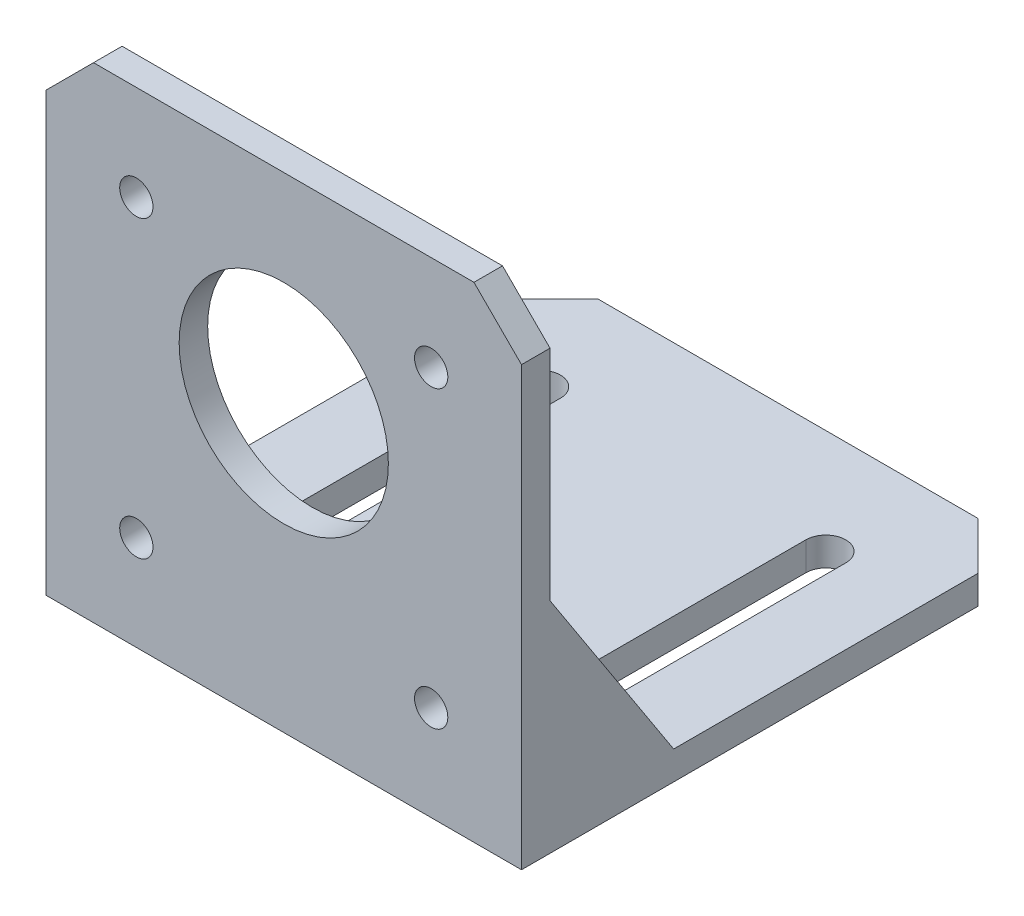
ISO-10303-21;
HEADER;
FILE_DESCRIPTION(('STEP AP214'),'2;1');
FILE_NAME('part.step','',(''),(''),'','','');
FILE_SCHEMA(('AUTOMOTIVE_DESIGN { 1 0 10303 214 1 1 1 1 }'));
ENDSEC;
DATA;
#1=APPLICATION_CONTEXT('core data for automotive mechanical design processes');
#2=APPLICATION_PROTOCOL_DEFINITION('international standard','automotive_design',2000,#1);
#3=PRODUCT_CONTEXT('',#1,'mechanical');
#4=PRODUCT('Part','Part','',(#3));
#5=PRODUCT_RELATED_PRODUCT_CATEGORY('part','',(#4));
#6=PRODUCT_DEFINITION_FORMATION('','',#4);
#7=PRODUCT_DEFINITION_CONTEXT('part definition',#1,'design');
#8=PRODUCT_DEFINITION('design','',#6,#7);
#9=PRODUCT_DEFINITION_SHAPE('','',#8);
#10=(LENGTH_UNIT() NAMED_UNIT(*) SI_UNIT(.MILLI.,.METRE.));
#11=(NAMED_UNIT(*) PLANE_ANGLE_UNIT() SI_UNIT($,.RADIAN.));
#12=(NAMED_UNIT(*) SI_UNIT($,.STERADIAN.) SOLID_ANGLE_UNIT());
#13=UNCERTAINTY_MEASURE_WITH_UNIT(LENGTH_MEASURE(1.E-05),#10,'distance_accuracy_value','');
#14=(GEOMETRIC_REPRESENTATION_CONTEXT(3) GLOBAL_UNCERTAINTY_ASSIGNED_CONTEXT((#13)) GLOBAL_UNIT_ASSIGNED_CONTEXT((#10,
#11,#12)) REPRESENTATION_CONTEXT('',''));
#15=CARTESIAN_POINT('',(0.,0.,0.));
#16=DIRECTION('',(0.,0.,1.));
#17=DIRECTION('',(1.,0.,0.));
#18=AXIS2_PLACEMENT_3D('',#15,#16,#17);
#19=CARTESIAN_POINT('',(0.,0.,0.));
#20=DIRECTION('',(0.,0.,1.));
#21=DIRECTION('',(1.,0.,0.));
#22=AXIS2_PLACEMENT_3D('',#19,#20,#21);
#23=PLANE('',#22);
#24=CARTESIAN_POINT('',(15.5,15.5,0.));
#25=DIRECTION('',(0.,0.,1.));
#26=DIRECTION('',(-1.,0.,0.));
#27=AXIS2_PLACEMENT_3D('',#24,#25,#26);
#28=CIRCLE('',#27,1.75);
#29=CARTESIAN_POINT('',(13.75,15.5,0.));
#30=VERTEX_POINT('',#29);
#31=EDGE_CURVE('E289',#30,#30,#28,.T.);
#32=ORIENTED_EDGE('',*,*,#31,.T.);
#33=EDGE_LOOP('',(#32));
#34=FACE_BOUND('',#33,.T.);
#35=CARTESIAN_POINT('',(-15.5,-15.5,0.));
#36=DIRECTION('',(0.,0.,1.));
#37=DIRECTION('',(-1.,0.,0.));
#38=AXIS2_PLACEMENT_3D('',#35,#36,#37);
#39=CIRCLE('',#38,1.75);
#40=CARTESIAN_POINT('',(-17.25,-15.5,0.));
#41=VERTEX_POINT('',#40);
#42=EDGE_CURVE('E296',#41,#41,#39,.T.);
#43=ORIENTED_EDGE('',*,*,#42,.T.);
#44=EDGE_LOOP('',(#43));
#45=FACE_BOUND('',#44,.T.);
#46=CARTESIAN_POINT('',(0.,4.50000000000001,0.));
#47=DIRECTION('',(0.,0.,1.));
#48=DIRECTION('',(1.,0.,0.));
#49=AXIS2_PLACEMENT_3D('',#46,#47,#48);
#50=CIRCLE('',#49,11.);
#51=CARTESIAN_POINT('',(11.,4.50000000000001,0.));
#52=VERTEX_POINT('',#51);
#53=EDGE_CURVE('E308',#52,#52,#50,.T.);
#54=ORIENTED_EDGE('',*,*,#53,.T.);
#55=EDGE_LOOP('',(#54));
#56=FACE_BOUND('',#55,.T.);
#57=CARTESIAN_POINT('',(-15.5,15.5,0.));
#58=DIRECTION('',(0.,0.,1.));
#59=DIRECTION('',(1.,0.,0.));
#60=AXIS2_PLACEMENT_3D('',#57,#58,#59);
#61=CIRCLE('',#60,1.75);
#62=CARTESIAN_POINT('',(-13.75,15.5,0.));
#63=VERTEX_POINT('',#62);
#64=EDGE_CURVE('E302',#63,#63,#61,.T.);
#65=ORIENTED_EDGE('',*,*,#64,.T.);
#66=EDGE_LOOP('',(#65));
#67=FACE_BOUND('',#66,.T.);
#68=CARTESIAN_POINT('',(15.5,-15.5,0.));
#69=DIRECTION('',(0.,0.,1.));
#70=DIRECTION('',(1.,0.,0.));
#71=AXIS2_PLACEMENT_3D('',#68,#69,#70);
#72=CIRCLE('',#71,1.75);
#73=CARTESIAN_POINT('',(17.25,-15.5,0.));
#74=VERTEX_POINT('',#73);
#75=EDGE_CURVE('E288',#74,#74,#72,.T.);
#76=ORIENTED_EDGE('',*,*,#75,.T.);
#77=EDGE_LOOP('',(#76));
#78=FACE_BOUND('',#77,.T.);
#79=DIRECTION('',(0.,1.,0.));
#80=VECTOR('',#79,1.);
#81=CARTESIAN_POINT('',(-22.,-22.5,0.));
#82=LINE('',#81,#80);
#83=CARTESIAN_POINT('',(-22.,-22.5,0.));
#84=VERTEX_POINT('',#83);
#85=CARTESIAN_POINT('',(-22.,-2.50000000000002,0.));
#86=VERTEX_POINT('',#85);
#87=EDGE_CURVE('E52',#84,#86,#82,.T.);
#88=ORIENTED_EDGE('',*,*,#87,.T.);
#89=DIRECTION('',(-1.,0.,0.));
#90=VECTOR('',#89,1.);
#91=CARTESIAN_POINT('',(-22.,-2.50000000000002,0.));
#92=LINE('',#91,#90);
#93=CARTESIAN_POINT('',(-25.,-2.50000000000002,0.));
#94=VERTEX_POINT('',#93);
#95=EDGE_CURVE('E56',#86,#94,#92,.T.);
#96=ORIENTED_EDGE('',*,*,#95,.T.);
#97=DIRECTION('',(0.,-1.,0.));
#98=VECTOR('',#97,1.);
#99=CARTESIAN_POINT('',(-25.,25.5,0.));
#100=LINE('',#99,#98);
#101=CARTESIAN_POINT('',(-25.,20.5,0.));
#102=VERTEX_POINT('',#101);
#103=EDGE_CURVE('E321',#102,#94,#100,.T.);
#104=ORIENTED_EDGE('',*,*,#103,.F.);
#105=DIRECTION('',(-0.707106781186549,-0.707106781186546,0.));
#106=VECTOR('',#105,1.);
#107=CARTESIAN_POINT('',(-25.,20.5,0.));
#108=LINE('',#107,#106);
#109=CARTESIAN_POINT('',(-20.,25.5,0.));
#110=VERTEX_POINT('',#109);
#111=EDGE_CURVE('E733',#102,#110,#108,.F.);
#112=ORIENTED_EDGE('',*,*,#111,.T.);
#113=DIRECTION('',(-1.,0.,0.));
#114=VECTOR('',#113,1.);
#115=CARTESIAN_POINT('',(-25.,25.5,0.));
#116=LINE('',#115,#114);
#117=CARTESIAN_POINT('',(20.,25.5,0.));
#118=VERTEX_POINT('',#117);
#119=EDGE_CURVE('E331',#118,#110,#116,.T.);
#120=ORIENTED_EDGE('',*,*,#119,.F.);
#121=DIRECTION('',(-0.707106781186546,0.707106781186549,0.));
#122=VECTOR('',#121,1.);
#123=CARTESIAN_POINT('',(20.,25.5,0.));
#124=LINE('',#123,#122);
#125=CARTESIAN_POINT('',(25.,20.5,0.));
#126=VERTEX_POINT('',#125);
#127=EDGE_CURVE('E730',#118,#126,#124,.F.);
#128=ORIENTED_EDGE('',*,*,#127,.T.);
#129=DIRECTION('',(0.,1.,0.));
#130=VECTOR('',#129,1.);
#131=CARTESIAN_POINT('',(25.,25.5,0.));
#132=LINE('',#131,#130);
#133=CARTESIAN_POINT('',(25.,-2.50000000000002,0.));
#134=VERTEX_POINT('',#133);
#135=EDGE_CURVE('E314',#134,#126,#132,.T.);
#136=ORIENTED_EDGE('',*,*,#135,.F.);
#137=DIRECTION('',(1.,0.,0.));
#138=VECTOR('',#137,1.);
#139=CARTESIAN_POINT('',(22.,-2.50000000000002,0.));
#140=LINE('',#139,#138);
#141=CARTESIAN_POINT('',(22.,-2.50000000000002,0.));
#142=VERTEX_POINT('',#141);
#143=EDGE_CURVE('E202',#142,#134,#140,.T.);
#144=ORIENTED_EDGE('',*,*,#143,.F.);
#145=DIRECTION('',(0.,-1.,0.));
#146=VECTOR('',#145,1.);
#147=CARTESIAN_POINT('',(22.,-22.5,0.));
#148=LINE('',#147,#146);
#149=CARTESIAN_POINT('',(22.,-22.5,0.));
#150=VERTEX_POINT('',#149);
#151=EDGE_CURVE('E196',#142,#150,#148,.T.);
#152=ORIENTED_EDGE('',*,*,#151,.T.);
#153=DIRECTION('',(1.,0.,0.));
#154=VECTOR('',#153,1.);
#155=CARTESIAN_POINT('',(-25.,-22.5,0.));
#156=LINE('',#155,#154);
#157=EDGE_CURVE('E38',#84,#150,#156,.T.);
#158=ORIENTED_EDGE('',*,*,#157,.F.);
#159=EDGE_LOOP('',(#88,#96,#104,#112,#120,#128,#136,#144,#152,#158));
#160=FACE_BOUND('',#159,.T.);
#161=ADVANCED_FACE('F34',(#34,#45,#56,#67,#78,#160),#23,.F.);
#162=CARTESIAN_POINT('',(0.,0.,3.));
#163=DIRECTION('',(0.,0.,1.));
#164=DIRECTION('',(1.,0.,0.));
#165=AXIS2_PLACEMENT_3D('',#162,#163,#164);
#166=PLANE('',#165);
#167=CARTESIAN_POINT('',(15.5,-15.5,3.));
#168=DIRECTION('',(0.,0.,1.));
#169=DIRECTION('',(1.,0.,0.));
#170=AXIS2_PLACEMENT_3D('',#167,#168,#169);
#171=CIRCLE('',#170,1.75);
#172=CARTESIAN_POINT('',(17.25,-15.5,3.));
#173=VERTEX_POINT('',#172);
#174=EDGE_CURVE('E293',#173,#173,#171,.T.);
#175=ORIENTED_EDGE('',*,*,#174,.F.);
#176=EDGE_LOOP('',(#175));
#177=FACE_BOUND('',#176,.T.);
#178=CARTESIAN_POINT('',(-15.5,15.5,3.));
#179=DIRECTION('',(0.,0.,1.));
#180=DIRECTION('',(1.,0.,0.));
#181=AXIS2_PLACEMENT_3D('',#178,#179,#180);
#182=CIRCLE('',#181,1.75);
#183=CARTESIAN_POINT('',(-13.75,15.5,3.));
#184=VERTEX_POINT('',#183);
#185=EDGE_CURVE('E305',#184,#184,#182,.T.);
#186=ORIENTED_EDGE('',*,*,#185,.F.);
#187=EDGE_LOOP('',(#186));
#188=FACE_BOUND('',#187,.T.);
#189=DIRECTION('',(-1.,0.,0.));
#190=VECTOR('',#189,1.);
#191=CARTESIAN_POINT('',(-25.,25.5,3.));
#192=LINE('',#191,#190);
#193=CARTESIAN_POINT('',(20.,25.5,3.));
#194=VERTEX_POINT('',#193);
#195=CARTESIAN_POINT('',(-20.,25.5,3.));
#196=VERTEX_POINT('',#195);
#197=EDGE_CURVE('E320',#194,#196,#192,.T.);
#198=ORIENTED_EDGE('',*,*,#197,.T.);
#199=DIRECTION('',(0.707106781186549,0.707106781186546,0.));
#200=VECTOR('',#199,1.);
#201=CARTESIAN_POINT('',(-22.7499999999999,22.75,3.));
#202=LINE('',#201,#200);
#203=CARTESIAN_POINT('',(-25.,20.5,3.));
#204=VERTEX_POINT('',#203);
#205=EDGE_CURVE('E742',#196,#204,#202,.F.);
#206=ORIENTED_EDGE('',*,*,#205,.T.);
#207=DIRECTION('',(0.,-1.,0.));
#208=VECTOR('',#207,1.);
#209=CARTESIAN_POINT('',(-25.,25.5,3.));
#210=LINE('',#209,#208);
#211=CARTESIAN_POINT('',(-25.,-25.5,3.));
#212=VERTEX_POINT('',#211);
#213=EDGE_CURVE('E324',#204,#212,#210,.T.);
#214=ORIENTED_EDGE('',*,*,#213,.T.);
#215=DIRECTION('',(1.,0.,0.));
#216=VECTOR('',#215,1.);
#217=CARTESIAN_POINT('',(-25.,-25.5,3.));
#218=LINE('',#217,#216);
#219=CARTESIAN_POINT('',(25.,-25.5,3.));
#220=VERTEX_POINT('',#219);
#221=EDGE_CURVE('E326',#212,#220,#218,.T.);
#222=ORIENTED_EDGE('',*,*,#221,.T.);
#223=DIRECTION('',(0.,1.,0.));
#224=VECTOR('',#223,1.);
#225=CARTESIAN_POINT('',(25.,25.5,3.));
#226=LINE('',#225,#224);
#227=CARTESIAN_POINT('',(25.,20.5,3.));
#228=VERTEX_POINT('',#227);
#229=EDGE_CURVE('E317',#220,#228,#226,.T.);
#230=ORIENTED_EDGE('',*,*,#229,.T.);
#231=DIRECTION('',(0.707106781186546,-0.707106781186549,0.));
#232=VECTOR('',#231,1.);
#233=CARTESIAN_POINT('',(22.75,22.7499999999999,3.));
#234=LINE('',#233,#232);
#235=EDGE_CURVE('E740',#228,#194,#234,.F.);
#236=ORIENTED_EDGE('',*,*,#235,.T.);
#237=EDGE_LOOP('',(#198,#206,#214,#222,#230,#236));
#238=FACE_BOUND('',#237,.T.);
#239=CARTESIAN_POINT('',(0.,4.50000000000001,3.));
#240=DIRECTION('',(0.,0.,1.));
#241=DIRECTION('',(1.,0.,0.));
#242=AXIS2_PLACEMENT_3D('',#239,#240,#241);
#243=CIRCLE('',#242,11.);
#244=CARTESIAN_POINT('',(11.,4.50000000000001,3.));
#245=VERTEX_POINT('',#244);
#246=EDGE_CURVE('E311',#245,#245,#243,.T.);
#247=ORIENTED_EDGE('',*,*,#246,.F.);
#248=EDGE_LOOP('',(#247));
#249=FACE_BOUND('',#248,.T.);
#250=CARTESIAN_POINT('',(-15.5,-15.5,3.));
#251=DIRECTION('',(0.,0.,1.));
#252=DIRECTION('',(-1.,0.,0.));
#253=AXIS2_PLACEMENT_3D('',#250,#251,#252);
#254=CIRCLE('',#253,1.75);
#255=CARTESIAN_POINT('',(-17.25,-15.5,3.));
#256=VERTEX_POINT('',#255);
#257=EDGE_CURVE('E299',#256,#256,#254,.T.);
#258=ORIENTED_EDGE('',*,*,#257,.F.);
#259=EDGE_LOOP('',(#258));
#260=FACE_BOUND('',#259,.T.);
#261=CARTESIAN_POINT('',(15.5,15.5,3.));
#262=DIRECTION('',(0.,0.,1.));
#263=DIRECTION('',(-1.,0.,0.));
#264=AXIS2_PLACEMENT_3D('',#261,#262,#263);
#265=CIRCLE('',#264,1.75);
#266=CARTESIAN_POINT('',(13.75,15.5,3.));
#267=VERTEX_POINT('',#266);
#268=EDGE_CURVE('E285',#267,#267,#265,.T.);
#269=ORIENTED_EDGE('',*,*,#268,.F.);
#270=EDGE_LOOP('',(#269));
#271=FACE_BOUND('',#270,.T.);
#272=ADVANCED_FACE('F405',(#177,#188,#238,#249,#260,#271),#166,.T.);
#273=CARTESIAN_POINT('',(25.,25.5,3.));
#274=DIRECTION('',(-1.,0.,0.));
#275=DIRECTION('',(0.,-1.,0.));
#276=AXIS2_PLACEMENT_3D('',#273,#274,#275);
#277=PLANE('',#276);
#278=DIRECTION('',(0.,0.838443616300637,0.544988350595414));
#279=VECTOR('',#278,1.);
#280=CARTESIAN_POINT('',(25.,-2.50000000000002,0.));
#281=LINE('',#280,#279);
#282=CARTESIAN_POINT('',(25.,-22.5,-13.));
#283=VERTEX_POINT('',#282);
#284=EDGE_CURVE('E203',#283,#134,#281,.T.);
#285=ORIENTED_EDGE('',*,*,#284,.T.);
#286=ORIENTED_EDGE('',*,*,#135,.T.);
#287=DIRECTION('',(0.,0.,1.));
#288=VECTOR('',#287,1.);
#289=CARTESIAN_POINT('',(25.,20.5,3.));
#290=LINE('',#289,#288);
#291=EDGE_CURVE('E354',#126,#228,#290,.T.);
#292=ORIENTED_EDGE('',*,*,#291,.T.);
#293=ORIENTED_EDGE('',*,*,#229,.F.);
#294=DIRECTION('',(0.,0.,-1.));
#295=VECTOR('',#294,1.);
#296=CARTESIAN_POINT('',(25.,-25.5,3.));
#297=LINE('',#296,#295);
#298=CARTESIAN_POINT('',(25.,-25.5,-45.));
#299=VERTEX_POINT('',#298);
#300=EDGE_CURVE('E328',#220,#299,#297,.T.);
#301=ORIENTED_EDGE('',*,*,#300,.T.);
#302=DIRECTION('',(0.,1.,0.));
#303=VECTOR('',#302,1.);
#304=CARTESIAN_POINT('',(25.,-22.5,-45.));
#305=LINE('',#304,#303);
#306=CARTESIAN_POINT('',(25.,-22.5,-45.));
#307=VERTEX_POINT('',#306);
#308=EDGE_CURVE('E11',#299,#307,#305,.T.);
#309=ORIENTED_EDGE('',*,*,#308,.T.);
#310=DIRECTION('',(0.,0.,1.));
#311=VECTOR('',#310,1.);
#312=CARTESIAN_POINT('',(25.,-22.5,-50.));
#313=LINE('',#312,#311);
#314=EDGE_CURVE('E282',#307,#283,#313,.T.);
#315=ORIENTED_EDGE('',*,*,#314,.T.);
#316=EDGE_LOOP('',(#285,#286,#292,#293,#301,#309,#315));
#317=FACE_BOUND('',#316,.T.);
#318=ADVANCED_FACE('F411',(#317),#277,.F.);
#319=CARTESIAN_POINT('',(-25.,25.5,3.));
#320=DIRECTION('',(0.,-1.,0.));
#321=DIRECTION('',(0.,0.,-1.));
#322=AXIS2_PLACEMENT_3D('',#319,#320,#321);
#323=PLANE('',#322);
#324=ORIENTED_EDGE('',*,*,#119,.T.);
#325=DIRECTION('',(0.,0.,1.));
#326=VECTOR('',#325,1.);
#327=CARTESIAN_POINT('',(-20.,25.5,3.));
#328=LINE('',#327,#326);
#329=EDGE_CURVE('E738',#110,#196,#328,.T.);
#330=ORIENTED_EDGE('',*,*,#329,.T.);
#331=ORIENTED_EDGE('',*,*,#197,.F.);
#332=DIRECTION('',(0.,0.,-1.));
#333=VECTOR('',#332,1.);
#334=CARTESIAN_POINT('',(20.,25.5,3.));
#335=LINE('',#334,#333);
#336=EDGE_CURVE('E735',#194,#118,#335,.T.);
#337=ORIENTED_EDGE('',*,*,#336,.T.);
#338=EDGE_LOOP('',(#324,#330,#331,#337));
#339=FACE_BOUND('',#338,.T.);
#340=ADVANCED_FACE('F423',(#339),#323,.F.);
#341=CARTESIAN_POINT('',(-25.,25.5,3.));
#342=DIRECTION('',(1.,0.,0.));
#343=DIRECTION('',(0.,1.,0.));
#344=AXIS2_PLACEMENT_3D('',#341,#342,#343);
#345=PLANE('',#344);
#346=ORIENTED_EDGE('',*,*,#103,.T.);
#347=DIRECTION('',(0.,-0.838443616300637,-0.544988350595414));
#348=VECTOR('',#347,1.);
#349=CARTESIAN_POINT('',(-25.,-2.50000000000002,0.));
#350=LINE('',#349,#348);
#351=CARTESIAN_POINT('',(-25.,-22.5,-13.));
#352=VERTEX_POINT('',#351);
#353=EDGE_CURVE('E385',#94,#352,#350,.T.);
#354=ORIENTED_EDGE('',*,*,#353,.T.);
#355=DIRECTION('',(0.,0.,1.));
#356=VECTOR('',#355,1.);
#357=CARTESIAN_POINT('',(-25.,-22.5,-50.));
#358=LINE('',#357,#356);
#359=CARTESIAN_POINT('',(-25.,-22.5,-45.));
#360=VERTEX_POINT('',#359);
#361=EDGE_CURVE('E292',#360,#352,#358,.T.);
#362=ORIENTED_EDGE('',*,*,#361,.F.);
#363=DIRECTION('',(0.,-1.,0.));
#364=VECTOR('',#363,1.);
#365=CARTESIAN_POINT('',(-25.,-25.5,-45.));
#366=LINE('',#365,#364);
#367=CARTESIAN_POINT('',(-25.,-25.5,-45.));
#368=VERTEX_POINT('',#367);
#369=EDGE_CURVE('E337',#360,#368,#366,.T.);
#370=ORIENTED_EDGE('',*,*,#369,.T.);
#371=DIRECTION('',(0.,0.,-1.));
#372=VECTOR('',#371,1.);
#373=CARTESIAN_POINT('',(-25.,-25.5,3.));
#374=LINE('',#373,#372);
#375=EDGE_CURVE('E377',#212,#368,#374,.T.);
#376=ORIENTED_EDGE('',*,*,#375,.F.);
#377=ORIENTED_EDGE('',*,*,#213,.F.);
#378=DIRECTION('',(0.,0.,-1.));
#379=VECTOR('',#378,1.);
#380=CARTESIAN_POINT('',(-25.,20.5,3.));
#381=LINE('',#380,#379);
#382=EDGE_CURVE('E724',#204,#102,#381,.T.);
#383=ORIENTED_EDGE('',*,*,#382,.T.);
#384=EDGE_LOOP('',(#346,#354,#362,#370,#376,#377,#383));
#385=FACE_BOUND('',#384,.T.);
#386=ADVANCED_FACE('F381',(#385),#345,.F.);
#387=CARTESIAN_POINT('',(-25.,-25.5,3.));
#388=DIRECTION('',(0.,1.,0.));
#389=DIRECTION('',(0.,0.,1.));
#390=AXIS2_PLACEMENT_3D('',#387,#388,#389);
#391=PLANE('',#390);
#392=DIRECTION('',(0.,0.,-1.));
#393=VECTOR('',#392,1.);
#394=CARTESIAN_POINT('',(17.1,-25.5,3.00000000000002));
#395=LINE('',#394,#393);
#396=CARTESIAN_POINT('',(17.1,-25.5,-9.00000000000001));
#397=VERTEX_POINT('',#396);
#398=CARTESIAN_POINT('',(17.1,-25.5,-39.));
#399=VERTEX_POINT('',#398);
#400=EDGE_CURVE('E241',#397,#399,#395,.T.);
#401=ORIENTED_EDGE('',*,*,#400,.T.);
#402=CARTESIAN_POINT('',(15.,-25.5,-39.));
#403=DIRECTION('',(0.,1.,0.));
#404=DIRECTION('',(0.,0.,1.));
#405=AXIS2_PLACEMENT_3D('',#402,#403,#404);
#406=CIRCLE('',#405,2.1);
#407=CARTESIAN_POINT('',(12.9,-25.5,-39.));
#408=VERTEX_POINT('',#407);
#409=EDGE_CURVE('E244',#399,#408,#406,.T.);
#410=ORIENTED_EDGE('',*,*,#409,.T.);
#411=DIRECTION('',(0.,0.,1.));
#412=VECTOR('',#411,1.);
#413=CARTESIAN_POINT('',(12.9,-25.5,3.00000000000001));
#414=LINE('',#413,#412);
#415=CARTESIAN_POINT('',(12.9,-25.5,-9.00000000000001));
#416=VERTEX_POINT('',#415);
#417=EDGE_CURVE('E229',#408,#416,#414,.T.);
#418=ORIENTED_EDGE('',*,*,#417,.T.);
#419=CARTESIAN_POINT('',(15.,-25.5,-9.00000000000001));
#420=DIRECTION('',(0.,1.,0.));
#421=DIRECTION('',(0.,0.,1.));
#422=AXIS2_PLACEMENT_3D('',#419,#420,#421);
#423=CIRCLE('',#422,2.1);
#424=EDGE_CURVE('E238',#416,#397,#423,.T.);
#425=ORIENTED_EDGE('',*,*,#424,.T.);
#426=EDGE_LOOP('',(#401,#410,#418,#425));
#427=FACE_BOUND('',#426,.T.);
#428=DIRECTION('',(0.,0.,-1.));
#429=VECTOR('',#428,1.);
#430=CARTESIAN_POINT('',(-12.9,-25.5,3.));
#431=LINE('',#430,#429);
#432=CARTESIAN_POINT('',(-12.9,-25.5,-9.00000000000001));
#433=VERTEX_POINT('',#432);
#434=CARTESIAN_POINT('',(-12.9,-25.5,-39.));
#435=VERTEX_POINT('',#434);
#436=EDGE_CURVE('E273',#433,#435,#431,.T.);
#437=ORIENTED_EDGE('',*,*,#436,.T.);
#438=CARTESIAN_POINT('',(-15.,-25.5,-39.));
#439=DIRECTION('',(0.,1.,0.));
#440=DIRECTION('',(0.,0.,1.));
#441=AXIS2_PLACEMENT_3D('',#438,#439,#440);
#442=CIRCLE('',#441,2.1);
#443=CARTESIAN_POINT('',(-17.1,-25.5,-39.));
#444=VERTEX_POINT('',#443);
#445=EDGE_CURVE('E192',#435,#444,#442,.T.);
#446=ORIENTED_EDGE('',*,*,#445,.T.);
#447=DIRECTION('',(0.,0.,1.));
#448=VECTOR('',#447,1.);
#449=CARTESIAN_POINT('',(-17.1,-25.5,3.));
#450=LINE('',#449,#448);
#451=CARTESIAN_POINT('',(-17.1,-25.5,-9.00000000000001));
#452=VERTEX_POINT('',#451);
#453=EDGE_CURVE('E261',#444,#452,#450,.T.);
#454=ORIENTED_EDGE('',*,*,#453,.T.);
#455=CARTESIAN_POINT('',(-15.,-25.5,-9.00000000000001));
#456=DIRECTION('',(0.,1.,0.));
#457=DIRECTION('',(0.,0.,1.));
#458=AXIS2_PLACEMENT_3D('',#455,#456,#457);
#459=CIRCLE('',#458,2.1);
#460=EDGE_CURVE('E270',#452,#433,#459,.T.);
#461=ORIENTED_EDGE('',*,*,#460,.T.);
#462=EDGE_LOOP('',(#437,#446,#454,#461));
#463=FACE_BOUND('',#462,.T.);
#464=ORIENTED_EDGE('',*,*,#375,.T.);
#465=DIRECTION('',(0.707106781186547,0.,-0.707106781186549));
#466=VECTOR('',#465,1.);
#467=CARTESIAN_POINT('',(-20.,-25.5,-50.));
#468=LINE('',#467,#466);
#469=CARTESIAN_POINT('',(-20.,-25.5,-50.));
#470=VERTEX_POINT('',#469);
#471=EDGE_CURVE('E44',#368,#470,#468,.T.);
#472=ORIENTED_EDGE('',*,*,#471,.T.);
#473=DIRECTION('',(-1.,0.,0.));
#474=VECTOR('',#473,1.);
#475=CARTESIAN_POINT('',(25.,-25.5,-50.));
#476=LINE('',#475,#474);
#477=CARTESIAN_POINT('',(20.,-25.5,-50.));
#478=VERTEX_POINT('',#477);
#479=EDGE_CURVE('E191',#478,#470,#476,.T.);
#480=ORIENTED_EDGE('',*,*,#479,.F.);
#481=DIRECTION('',(0.707106781186546,0.,0.70710678118655));
#482=VECTOR('',#481,1.);
#483=CARTESIAN_POINT('',(20.,-25.5,-50.));
#484=LINE('',#483,#482);
#485=EDGE_CURVE('E335',#478,#299,#484,.T.);
#486=ORIENTED_EDGE('',*,*,#485,.T.);
#487=ORIENTED_EDGE('',*,*,#300,.F.);
#488=ORIENTED_EDGE('',*,*,#221,.F.);
#489=EDGE_LOOP('',(#464,#472,#480,#486,#487,#488));
#490=FACE_BOUND('',#489,.T.);
#491=ADVANCED_FACE('F372',(#427,#463,#490),#391,.F.);
#492=CARTESIAN_POINT('',(0.,4.50000000000001,3.));
#493=DIRECTION('',(0.,0.,-1.));
#494=DIRECTION('',(-1.,0.,0.));
#495=AXIS2_PLACEMENT_3D('',#492,#493,#494);
#496=CYLINDRICAL_SURFACE('',#495,11.);
#497=ORIENTED_EDGE('',*,*,#246,.T.);
#498=EDGE_LOOP('',(#497));
#499=FACE_BOUND('',#498,.T.);
#500=ORIENTED_EDGE('',*,*,#53,.F.);
#501=EDGE_LOOP('',(#500));
#502=FACE_BOUND('',#501,.T.);
#503=ADVANCED_FACE('F419',(#499,#502),#496,.F.);
#504=CARTESIAN_POINT('',(-15.5,15.5,3.));
#505=DIRECTION('',(0.,0.,-1.));
#506=DIRECTION('',(-1.,0.,0.));
#507=AXIS2_PLACEMENT_3D('',#504,#505,#506);
#508=CYLINDRICAL_SURFACE('',#507,1.75);
#509=ORIENTED_EDGE('',*,*,#185,.T.);
#510=EDGE_LOOP('',(#509));
#511=FACE_BOUND('',#510,.T.);
#512=ORIENTED_EDGE('',*,*,#64,.F.);
#513=EDGE_LOOP('',(#512));
#514=FACE_BOUND('',#513,.T.);
#515=ADVANCED_FACE('F463',(#511,#514),#508,.F.);
#516=CARTESIAN_POINT('',(-15.5,-15.5,3.));
#517=DIRECTION('',(0.,0.,-1.));
#518=DIRECTION('',(-1.,0.,0.));
#519=AXIS2_PLACEMENT_3D('',#516,#517,#518);
#520=CYLINDRICAL_SURFACE('',#519,1.75);
#521=ORIENTED_EDGE('',*,*,#257,.T.);
#522=EDGE_LOOP('',(#521));
#523=FACE_BOUND('',#522,.T.);
#524=ORIENTED_EDGE('',*,*,#42,.F.);
#525=EDGE_LOOP('',(#524));
#526=FACE_BOUND('',#525,.T.);
#527=ADVANCED_FACE('F459',(#523,#526),#520,.F.);
#528=CARTESIAN_POINT('',(15.5,-15.5,3.));
#529=DIRECTION('',(0.,0.,-1.));
#530=DIRECTION('',(-1.,0.,0.));
#531=AXIS2_PLACEMENT_3D('',#528,#529,#530);
#532=CYLINDRICAL_SURFACE('',#531,1.75);
#533=ORIENTED_EDGE('',*,*,#174,.T.);
#534=EDGE_LOOP('',(#533));
#535=FACE_BOUND('',#534,.T.);
#536=ORIENTED_EDGE('',*,*,#75,.F.);
#537=EDGE_LOOP('',(#536));
#538=FACE_BOUND('',#537,.T.);
#539=ADVANCED_FACE('F455',(#535,#538),#532,.F.);
#540=CARTESIAN_POINT('',(15.5,15.5,3.));
#541=DIRECTION('',(0.,0.,-1.));
#542=DIRECTION('',(-1.,0.,0.));
#543=AXIS2_PLACEMENT_3D('',#540,#541,#542);
#544=CYLINDRICAL_SURFACE('',#543,1.75);
#545=ORIENTED_EDGE('',*,*,#268,.T.);
#546=EDGE_LOOP('',(#545));
#547=FACE_BOUND('',#546,.T.);
#548=ORIENTED_EDGE('',*,*,#31,.F.);
#549=EDGE_LOOP('',(#548));
#550=FACE_BOUND('',#549,.T.);
#551=ADVANCED_FACE('F434',(#547,#550),#544,.F.);
#552=CARTESIAN_POINT('',(-25.,20.5,3.));
#553=DIRECTION('',(0.707106781186546,-0.707106781186549,0.));
#554=DIRECTION('',(0.,0.,-1.));
#555=AXIS2_PLACEMENT_3D('',#552,#553,#554);
#556=PLANE('',#555);
#557=ORIENTED_EDGE('',*,*,#205,.F.);
#558=ORIENTED_EDGE('',*,*,#329,.F.);
#559=ORIENTED_EDGE('',*,*,#111,.F.);
#560=ORIENTED_EDGE('',*,*,#382,.F.);
#561=EDGE_LOOP('',(#557,#558,#559,#560));
#562=FACE_BOUND('',#561,.T.);
#563=ADVANCED_FACE('F430',(#562),#556,.F.);
#564=CARTESIAN_POINT('',(20.,25.5,3.));
#565=DIRECTION('',(-0.707106781186549,-0.707106781186546,0.));
#566=DIRECTION('',(0.,0.,-1.));
#567=AXIS2_PLACEMENT_3D('',#564,#565,#566);
#568=PLANE('',#567);
#569=ORIENTED_EDGE('',*,*,#235,.F.);
#570=ORIENTED_EDGE('',*,*,#291,.F.);
#571=ORIENTED_EDGE('',*,*,#127,.F.);
#572=ORIENTED_EDGE('',*,*,#336,.F.);
#573=EDGE_LOOP('',(#569,#570,#571,#572));
#574=FACE_BOUND('',#573,.T.);
#575=ADVANCED_FACE('F433',(#574),#568,.F.);
#576=CARTESIAN_POINT('',(-25.,-22.5,-50.));
#577=DIRECTION('',(0.,-1.,0.));
#578=DIRECTION('',(1.,0.,0.));
#579=AXIS2_PLACEMENT_3D('',#576,#577,#578);
#580=PLANE('',#579);
#581=DIRECTION('',(0.,0.,1.));
#582=VECTOR('',#581,1.);
#583=CARTESIAN_POINT('',(12.9,-22.5,-39.));
#584=LINE('',#583,#582);
#585=CARTESIAN_POINT('',(12.9,-22.5,-39.));
#586=VERTEX_POINT('',#585);
#587=CARTESIAN_POINT('',(12.9,-22.5,-9.00000000000001));
#588=VERTEX_POINT('',#587);
#589=EDGE_CURVE('E217',#586,#588,#584,.T.);
#590=ORIENTED_EDGE('',*,*,#589,.F.);
#591=CARTESIAN_POINT('',(15.,-22.5,-39.));
#592=DIRECTION('',(0.,1.,0.));
#593=DIRECTION('',(-1.,0.,0.));
#594=AXIS2_PLACEMENT_3D('',#591,#592,#593);
#595=CIRCLE('',#594,2.1);
#596=CARTESIAN_POINT('',(17.1,-22.5,-39.));
#597=VERTEX_POINT('',#596);
#598=EDGE_CURVE('E214',#597,#586,#595,.T.);
#599=ORIENTED_EDGE('',*,*,#598,.F.);
#600=DIRECTION('',(0.,0.,-1.));
#601=VECTOR('',#600,1.);
#602=CARTESIAN_POINT('',(17.1,-22.5,-39.));
#603=LINE('',#602,#601);
#604=CARTESIAN_POINT('',(17.1,-22.5,-9.00000000000001));
#605=VERTEX_POINT('',#604);
#606=EDGE_CURVE('E223',#605,#597,#603,.T.);
#607=ORIENTED_EDGE('',*,*,#606,.F.);
#608=CARTESIAN_POINT('',(15.,-22.5,-9.00000000000001));
#609=DIRECTION('',(0.,1.,0.));
#610=DIRECTION('',(1.,0.,0.));
#611=AXIS2_PLACEMENT_3D('',#608,#609,#610);
#612=CIRCLE('',#611,2.1);
#613=EDGE_CURVE('E220',#588,#605,#612,.T.);
#614=ORIENTED_EDGE('',*,*,#613,.F.);
#615=EDGE_LOOP('',(#590,#599,#607,#614));
#616=FACE_BOUND('',#615,.T.);
#617=DIRECTION('',(0.,0.,1.));
#618=VECTOR('',#617,1.);
#619=CARTESIAN_POINT('',(-17.1,-22.5,-39.));
#620=LINE('',#619,#618);
#621=CARTESIAN_POINT('',(-17.1,-22.5,-39.));
#622=VERTEX_POINT('',#621);
#623=CARTESIAN_POINT('',(-17.1,-22.5,-9.00000000000001));
#624=VERTEX_POINT('',#623);
#625=EDGE_CURVE('E249',#622,#624,#620,.T.);
#626=ORIENTED_EDGE('',*,*,#625,.F.);
#627=CARTESIAN_POINT('',(-15.,-22.5,-39.));
#628=DIRECTION('',(0.,1.,0.));
#629=DIRECTION('',(1.,0.,0.));
#630=AXIS2_PLACEMENT_3D('',#627,#628,#629);
#631=CIRCLE('',#630,2.1);
#632=CARTESIAN_POINT('',(-12.9,-22.5,-39.));
#633=VERTEX_POINT('',#632);
#634=EDGE_CURVE('E247',#633,#622,#631,.T.);
#635=ORIENTED_EDGE('',*,*,#634,.F.);
#636=DIRECTION('',(0.,0.,-1.));
#637=VECTOR('',#636,1.);
#638=CARTESIAN_POINT('',(-12.9,-22.5,-39.));
#639=LINE('',#638,#637);
#640=CARTESIAN_POINT('',(-12.9,-22.5,-9.00000000000001));
#641=VERTEX_POINT('',#640);
#642=EDGE_CURVE('E255',#641,#633,#639,.T.);
#643=ORIENTED_EDGE('',*,*,#642,.F.);
#644=CARTESIAN_POINT('',(-15.,-22.5,-9.00000000000001));
#645=DIRECTION('',(0.,1.,0.));
#646=DIRECTION('',(-1.,0.,0.));
#647=AXIS2_PLACEMENT_3D('',#644,#645,#646);
#648=CIRCLE('',#647,2.1);
#649=EDGE_CURVE('E252',#624,#641,#648,.T.);
#650=ORIENTED_EDGE('',*,*,#649,.F.);
#651=EDGE_LOOP('',(#626,#635,#643,#650));
#652=FACE_BOUND('',#651,.T.);
#653=ORIENTED_EDGE('',*,*,#361,.T.);
#654=DIRECTION('',(-1.,0.,0.));
#655=VECTOR('',#654,1.);
#656=CARTESIAN_POINT('',(-22.,-22.5,-13.));
#657=LINE('',#656,#655);
#658=CARTESIAN_POINT('',(-22.,-22.5,-13.));
#659=VERTEX_POINT('',#658);
#660=EDGE_CURVE('E206',#659,#352,#657,.T.);
#661=ORIENTED_EDGE('',*,*,#660,.F.);
#662=DIRECTION('',(0.,0.,1.));
#663=VECTOR('',#662,1.);
#664=CARTESIAN_POINT('',(-22.,-22.5,-13.));
#665=LINE('',#664,#663);
#666=EDGE_CURVE('E189',#659,#84,#665,.T.);
#667=ORIENTED_EDGE('',*,*,#666,.T.);
#668=ORIENTED_EDGE('',*,*,#157,.T.);
#669=DIRECTION('',(0.,0.,-1.));
#670=VECTOR('',#669,1.);
#671=CARTESIAN_POINT('',(22.,-22.5,-13.));
#672=LINE('',#671,#670);
#673=CARTESIAN_POINT('',(22.,-22.5,-13.));
#674=VERTEX_POINT('',#673);
#675=EDGE_CURVE('E187',#150,#674,#672,.T.);
#676=ORIENTED_EDGE('',*,*,#675,.T.);
#677=DIRECTION('',(1.,0.,0.));
#678=VECTOR('',#677,1.);
#679=CARTESIAN_POINT('',(22.,-22.5,-13.));
#680=LINE('',#679,#678);
#681=EDGE_CURVE('E211',#674,#283,#680,.T.);
#682=ORIENTED_EDGE('',*,*,#681,.T.);
#683=ORIENTED_EDGE('',*,*,#314,.F.);
#684=DIRECTION('',(-0.707106781186546,0.,-0.70710678118655));
#685=VECTOR('',#684,1.);
#686=CARTESIAN_POINT('',(20.,-22.5,-50.));
#687=LINE('',#686,#685);
#688=CARTESIAN_POINT('',(20.,-22.5,-50.));
#689=VERTEX_POINT('',#688);
#690=EDGE_CURVE('E341',#307,#689,#687,.T.);
#691=ORIENTED_EDGE('',*,*,#690,.T.);
#692=DIRECTION('',(1.,0.,0.));
#693=VECTOR('',#692,1.);
#694=CARTESIAN_POINT('',(-25.,-22.5,-50.));
#695=LINE('',#694,#693);
#696=CARTESIAN_POINT('',(-20.,-22.5,-50.));
#697=VERTEX_POINT('',#696);
#698=EDGE_CURVE('E280',#697,#689,#695,.T.);
#699=ORIENTED_EDGE('',*,*,#698,.F.);
#700=DIRECTION('',(-0.707106781186547,0.,0.707106781186549));
#701=VECTOR('',#700,1.);
#702=CARTESIAN_POINT('',(-20.,-22.5,-50.));
#703=LINE('',#702,#701);
#704=EDGE_CURVE('E339',#697,#360,#703,.T.);
#705=ORIENTED_EDGE('',*,*,#704,.T.);
#706=EDGE_LOOP('',(#653,#661,#667,#668,#676,#682,#683,#691,#699,#705));
#707=FACE_BOUND('',#706,.T.);
#708=ADVANCED_FACE('F185',(#616,#652,#707),#580,.F.);
#709=CARTESIAN_POINT('',(0.,0.,-50.));
#710=DIRECTION('',(0.,0.,-1.));
#711=DIRECTION('',(-1.,0.,0.));
#712=AXIS2_PLACEMENT_3D('',#709,#710,#711);
#713=PLANE('',#712);
#714=ORIENTED_EDGE('',*,*,#479,.T.);
#715=DIRECTION('',(0.,1.,0.));
#716=VECTOR('',#715,1.);
#717=CARTESIAN_POINT('',(-20.,-22.5,-50.));
#718=LINE('',#717,#716);
#719=EDGE_CURVE('E343',#470,#697,#718,.T.);
#720=ORIENTED_EDGE('',*,*,#719,.T.);
#721=ORIENTED_EDGE('',*,*,#698,.T.);
#722=DIRECTION('',(0.,-1.,0.));
#723=VECTOR('',#722,1.);
#724=CARTESIAN_POINT('',(20.,-25.5,-50.));
#725=LINE('',#724,#723);
#726=EDGE_CURVE('E352',#689,#478,#725,.T.);
#727=ORIENTED_EDGE('',*,*,#726,.T.);
#728=EDGE_LOOP('',(#714,#720,#721,#727));
#729=FACE_BOUND('',#728,.T.);
#730=ADVANCED_FACE('F359',(#729),#713,.T.);
#731=CARTESIAN_POINT('',(-20.,0.,-50.));
#732=DIRECTION('',(-0.707106781186549,0.,-0.707106781186547));
#733=DIRECTION('',(0.,-1.,0.));
#734=AXIS2_PLACEMENT_3D('',#731,#732,#733);
#735=PLANE('',#734);
#736=ORIENTED_EDGE('',*,*,#471,.F.);
#737=ORIENTED_EDGE('',*,*,#369,.F.);
#738=ORIENTED_EDGE('',*,*,#704,.F.);
#739=ORIENTED_EDGE('',*,*,#719,.F.);
#740=EDGE_LOOP('',(#736,#737,#738,#739));
#741=FACE_BOUND('',#740,.T.);
#742=ADVANCED_FACE('F379',(#741),#735,.T.);
#743=CARTESIAN_POINT('',(20.,0.,-50.));
#744=DIRECTION('',(0.707106781186549,0.,-0.707106781186545));
#745=DIRECTION('',(0.,1.,0.));
#746=AXIS2_PLACEMENT_3D('',#743,#744,#745);
#747=PLANE('',#746);
#748=ORIENTED_EDGE('',*,*,#690,.F.);
#749=ORIENTED_EDGE('',*,*,#308,.F.);
#750=ORIENTED_EDGE('',*,*,#485,.F.);
#751=ORIENTED_EDGE('',*,*,#726,.F.);
#752=EDGE_LOOP('',(#748,#749,#750,#751));
#753=FACE_BOUND('',#752,.T.);
#754=ADVANCED_FACE('F36',(#753),#747,.T.);
#755=CARTESIAN_POINT('',(-15.,-72.5,-39.));
#756=DIRECTION('',(0.,1.,0.));
#757=DIRECTION('',(-1.,0.,0.));
#758=AXIS2_PLACEMENT_3D('',#755,#756,#757);
#759=CYLINDRICAL_SURFACE('',#758,2.1);
#760=DIRECTION('',(0.,1.,0.));
#761=VECTOR('',#760,1.);
#762=CARTESIAN_POINT('',(-12.9,-72.5,-39.));
#763=LINE('',#762,#761);
#764=EDGE_CURVE('E259',#435,#633,#763,.T.);
#765=ORIENTED_EDGE('',*,*,#764,.T.);
#766=ORIENTED_EDGE('',*,*,#634,.T.);
#767=DIRECTION('',(0.,1.,0.));
#768=VECTOR('',#767,1.);
#769=CARTESIAN_POINT('',(-17.1,-72.5,-39.));
#770=LINE('',#769,#768);
#771=EDGE_CURVE('E258',#444,#622,#770,.T.);
#772=ORIENTED_EDGE('',*,*,#771,.F.);
#773=ORIENTED_EDGE('',*,*,#445,.F.);
#774=EDGE_LOOP('',(#765,#766,#772,#773));
#775=FACE_BOUND('',#774,.T.);
#776=ADVANCED_FACE('F443',(#775),#759,.F.);
#777=CARTESIAN_POINT('',(-12.9,-72.5,-39.));
#778=DIRECTION('',(1.,0.,0.));
#779=DIRECTION('',(0.,1.,0.));
#780=AXIS2_PLACEMENT_3D('',#777,#778,#779);
#781=PLANE('',#780);
#782=DIRECTION('',(0.,1.,0.));
#783=VECTOR('',#782,1.);
#784=CARTESIAN_POINT('',(-12.9,-72.5,-9.00000000000001));
#785=LINE('',#784,#783);
#786=EDGE_CURVE('E262',#433,#641,#785,.T.);
#787=ORIENTED_EDGE('',*,*,#786,.T.);
#788=ORIENTED_EDGE('',*,*,#642,.T.);
#789=ORIENTED_EDGE('',*,*,#764,.F.);
#790=ORIENTED_EDGE('',*,*,#436,.F.);
#791=EDGE_LOOP('',(#787,#788,#789,#790));
#792=FACE_BOUND('',#791,.T.);
#793=ADVANCED_FACE('F600',(#792),#781,.F.);
#794=CARTESIAN_POINT('',(-15.,-72.5,-9.00000000000001));
#795=DIRECTION('',(0.,1.,0.));
#796=DIRECTION('',(-1.,0.,0.));
#797=AXIS2_PLACEMENT_3D('',#794,#795,#796);
#798=CYLINDRICAL_SURFACE('',#797,2.1);
#799=DIRECTION('',(0.,1.,0.));
#800=VECTOR('',#799,1.);
#801=CARTESIAN_POINT('',(-17.1,-72.5,-9.00000000000001));
#802=LINE('',#801,#800);
#803=EDGE_CURVE('E264',#452,#624,#802,.T.);
#804=ORIENTED_EDGE('',*,*,#803,.T.);
#805=ORIENTED_EDGE('',*,*,#649,.T.);
#806=ORIENTED_EDGE('',*,*,#786,.F.);
#807=ORIENTED_EDGE('',*,*,#460,.F.);
#808=EDGE_LOOP('',(#804,#805,#806,#807));
#809=FACE_BOUND('',#808,.T.);
#810=ADVANCED_FACE('F593',(#809),#798,.F.);
#811=CARTESIAN_POINT('',(-17.1,-72.5,-39.));
#812=DIRECTION('',(-1.,0.,0.));
#813=DIRECTION('',(0.,-1.,0.));
#814=AXIS2_PLACEMENT_3D('',#811,#812,#813);
#815=PLANE('',#814);
#816=ORIENTED_EDGE('',*,*,#771,.T.);
#817=ORIENTED_EDGE('',*,*,#625,.T.);
#818=ORIENTED_EDGE('',*,*,#803,.F.);
#819=ORIENTED_EDGE('',*,*,#453,.F.);
#820=EDGE_LOOP('',(#816,#817,#818,#819));
#821=FACE_BOUND('',#820,.T.);
#822=ADVANCED_FACE('F585',(#821),#815,.F.);
#823=CARTESIAN_POINT('',(15.,-72.5,-39.));
#824=DIRECTION('',(0.,1.,0.));
#825=DIRECTION('',(-1.,0.,0.));
#826=AXIS2_PLACEMENT_3D('',#823,#824,#825);
#827=CYLINDRICAL_SURFACE('',#826,2.1);
#828=DIRECTION('',(0.,1.,0.));
#829=VECTOR('',#828,1.);
#830=CARTESIAN_POINT('',(17.1,-72.5,-39.));
#831=LINE('',#830,#829);
#832=EDGE_CURVE('E227',#399,#597,#831,.T.);
#833=ORIENTED_EDGE('',*,*,#832,.T.);
#834=ORIENTED_EDGE('',*,*,#598,.T.);
#835=DIRECTION('',(0.,1.,0.));
#836=VECTOR('',#835,1.);
#837=CARTESIAN_POINT('',(12.9,-72.5,-39.));
#838=LINE('',#837,#836);
#839=EDGE_CURVE('E226',#408,#586,#838,.T.);
#840=ORIENTED_EDGE('',*,*,#839,.F.);
#841=ORIENTED_EDGE('',*,*,#409,.F.);
#842=EDGE_LOOP('',(#833,#834,#840,#841));
#843=FACE_BOUND('',#842,.T.);
#844=ADVANCED_FACE('F577',(#843),#827,.F.);
#845=CARTESIAN_POINT('',(17.1,-72.5,-39.));
#846=DIRECTION('',(1.,0.,0.));
#847=DIRECTION('',(0.,0.,-1.));
#848=AXIS2_PLACEMENT_3D('',#845,#846,#847);
#849=PLANE('',#848);
#850=DIRECTION('',(0.,1.,0.));
#851=VECTOR('',#850,1.);
#852=CARTESIAN_POINT('',(17.1,-72.5,-9.00000000000001));
#853=LINE('',#852,#851);
#854=EDGE_CURVE('E230',#397,#605,#853,.T.);
#855=ORIENTED_EDGE('',*,*,#854,.T.);
#856=ORIENTED_EDGE('',*,*,#606,.T.);
#857=ORIENTED_EDGE('',*,*,#832,.F.);
#858=ORIENTED_EDGE('',*,*,#400,.F.);
#859=EDGE_LOOP('',(#855,#856,#857,#858));
#860=FACE_BOUND('',#859,.T.);
#861=ADVANCED_FACE('F569',(#860),#849,.F.);
#862=CARTESIAN_POINT('',(15.,-72.5,-9.00000000000001));
#863=DIRECTION('',(0.,1.,0.));
#864=DIRECTION('',(-1.,0.,0.));
#865=AXIS2_PLACEMENT_3D('',#862,#863,#864);
#866=CYLINDRICAL_SURFACE('',#865,2.1);
#867=DIRECTION('',(0.,1.,0.));
#868=VECTOR('',#867,1.);
#869=CARTESIAN_POINT('',(12.9,-72.5,-9.00000000000001));
#870=LINE('',#869,#868);
#871=EDGE_CURVE('E232',#416,#588,#870,.T.);
#872=ORIENTED_EDGE('',*,*,#871,.T.);
#873=ORIENTED_EDGE('',*,*,#613,.T.);
#874=ORIENTED_EDGE('',*,*,#854,.F.);
#875=ORIENTED_EDGE('',*,*,#424,.F.);
#876=EDGE_LOOP('',(#872,#873,#874,#875));
#877=FACE_BOUND('',#876,.T.);
#878=ADVANCED_FACE('F561',(#877),#866,.F.);
#879=CARTESIAN_POINT('',(12.9,-72.5,-39.));
#880=DIRECTION('',(-1.,0.,0.));
#881=DIRECTION('',(0.,0.,1.));
#882=AXIS2_PLACEMENT_3D('',#879,#880,#881);
#883=PLANE('',#882);
#884=ORIENTED_EDGE('',*,*,#839,.T.);
#885=ORIENTED_EDGE('',*,*,#589,.T.);
#886=ORIENTED_EDGE('',*,*,#871,.F.);
#887=ORIENTED_EDGE('',*,*,#417,.F.);
#888=EDGE_LOOP('',(#884,#885,#886,#887));
#889=FACE_BOUND('',#888,.T.);
#890=ADVANCED_FACE('F552',(#889),#883,.F.);
#891=CARTESIAN_POINT('',(22.,-2.50000000000002,0.));
#892=DIRECTION('',(0.,0.544988350595414,-0.838443616300637));
#893=DIRECTION('',(0.,0.838443616300637,0.544988350595414));
#894=AXIS2_PLACEMENT_3D('',#891,#892,#893);
#895=PLANE('',#894);
#896=ORIENTED_EDGE('',*,*,#284,.F.);
#897=ORIENTED_EDGE('',*,*,#681,.F.);
#898=DIRECTION('',(0.,0.838443616300637,0.544988350595414));
#899=VECTOR('',#898,1.);
#900=CARTESIAN_POINT('',(22.,-2.50000000000002,0.));
#901=LINE('',#900,#899);
#902=EDGE_CURVE('E198',#674,#142,#901,.T.);
#903=ORIENTED_EDGE('',*,*,#902,.T.);
#904=ORIENTED_EDGE('',*,*,#143,.T.);
#905=EDGE_LOOP('',(#896,#897,#903,#904));
#906=FACE_BOUND('',#905,.T.);
#907=ADVANCED_FACE('F545',(#906),#895,.T.);
#908=CARTESIAN_POINT('',(22.,0.,0.));
#909=DIRECTION('',(1.,0.,0.));
#910=DIRECTION('',(0.,1.,0.));
#911=AXIS2_PLACEMENT_3D('',#908,#909,#910);
#912=PLANE('',#911);
#913=ORIENTED_EDGE('',*,*,#151,.F.);
#914=ORIENTED_EDGE('',*,*,#902,.F.);
#915=ORIENTED_EDGE('',*,*,#675,.F.);
#916=EDGE_LOOP('',(#913,#914,#915));
#917=FACE_BOUND('',#916,.T.);
#918=ADVANCED_FACE('F195',(#917),#912,.F.);
#919=CARTESIAN_POINT('',(-22.,-2.50000000000002,0.));
#920=DIRECTION('',(0.,0.544988350595414,-0.838443616300637));
#921=DIRECTION('',(0.,0.838443616300637,0.544988350595414));
#922=AXIS2_PLACEMENT_3D('',#919,#920,#921);
#923=PLANE('',#922);
#924=ORIENTED_EDGE('',*,*,#353,.F.);
#925=ORIENTED_EDGE('',*,*,#95,.F.);
#926=DIRECTION('',(0.,-0.838443616300637,-0.544988350595414));
#927=VECTOR('',#926,1.);
#928=CARTESIAN_POINT('',(-22.,-2.50000000000002,0.));
#929=LINE('',#928,#927);
#930=EDGE_CURVE('E391',#86,#659,#929,.T.);
#931=ORIENTED_EDGE('',*,*,#930,.T.);
#932=ORIENTED_EDGE('',*,*,#660,.T.);
#933=EDGE_LOOP('',(#924,#925,#931,#932));
#934=FACE_BOUND('',#933,.T.);
#935=ADVANCED_FACE('F389',(#934),#923,.T.);
#936=CARTESIAN_POINT('',(-22.,0.,0.));
#937=DIRECTION('',(-1.,0.,0.));
#938=DIRECTION('',(0.,-1.,0.));
#939=AXIS2_PLACEMENT_3D('',#936,#937,#938);
#940=PLANE('',#939);
#941=ORIENTED_EDGE('',*,*,#666,.F.);
#942=ORIENTED_EDGE('',*,*,#930,.F.);
#943=ORIENTED_EDGE('',*,*,#87,.F.);
#944=EDGE_LOOP('',(#941,#942,#943));
#945=FACE_BOUND('',#944,.T.);
#946=ADVANCED_FACE('F397',(#945),#940,.F.);
#947=CLOSED_SHELL('',(#161,#272,#318,#340,#386,#491,#503,#515,#527,#539,#551,#563,#575,#708,
#730,#742,#754,#776,#793,#810,#822,#844,#861,#878,#890,#907,#918,#935,#946));
#948=MANIFOLD_SOLID_BREP('B2',#947);
#949=ADVANCED_BREP_SHAPE_REPRESENTATION('',(#18,#948),#14);
#950=SHAPE_DEFINITION_REPRESENTATION(#9,#949);
ENDSEC;
END-ISO-10303-21;
